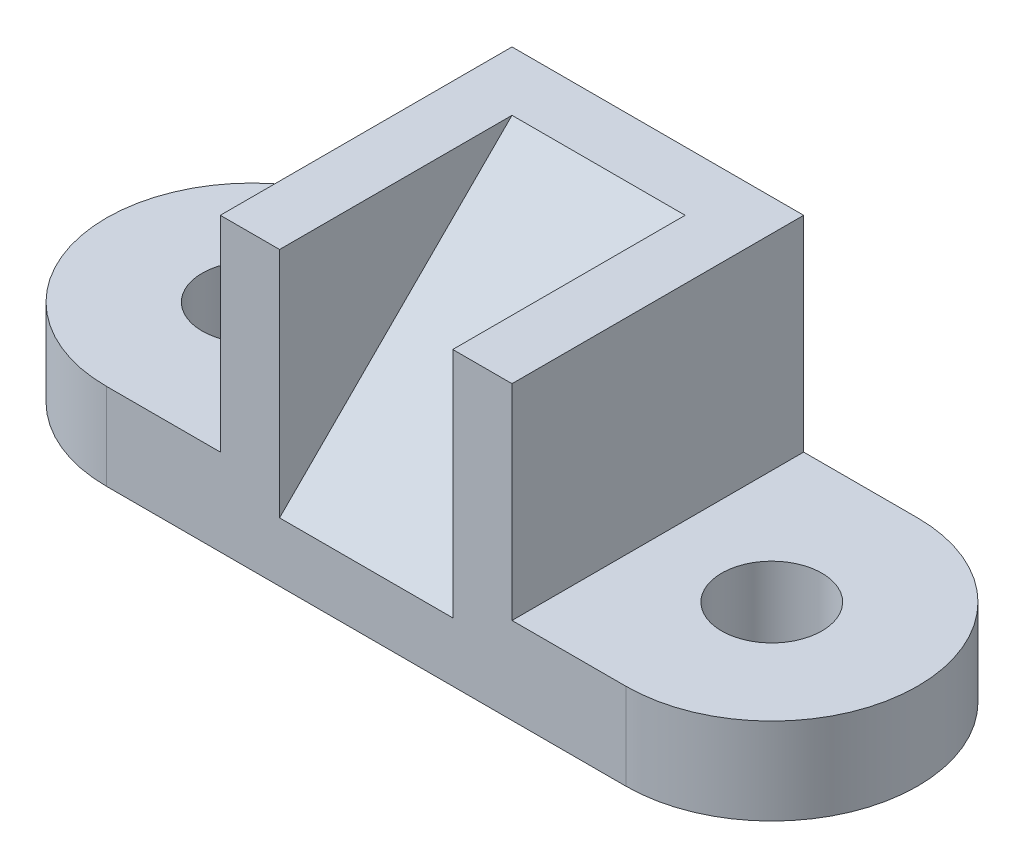
ISO-10303-21;
HEADER;
FILE_DESCRIPTION(('STEP AP214'),'2;1');
FILE_NAME('part.step','',(''),(''),'','','');
FILE_SCHEMA(('AUTOMOTIVE_DESIGN { 1 0 10303 214 1 1 1 1 }'));
ENDSEC;
DATA;
#1=APPLICATION_CONTEXT('core data for automotive mechanical design processes');
#2=APPLICATION_PROTOCOL_DEFINITION('international standard','automotive_design',2000,#1);
#3=PRODUCT_CONTEXT('',#1,'mechanical');
#4=PRODUCT('Part','Part','',(#3));
#5=PRODUCT_RELATED_PRODUCT_CATEGORY('part','',(#4));
#6=PRODUCT_DEFINITION_FORMATION('','',#4);
#7=PRODUCT_DEFINITION_CONTEXT('part definition',#1,'design');
#8=PRODUCT_DEFINITION('design','',#6,#7);
#9=PRODUCT_DEFINITION_SHAPE('','',#8);
#10=(LENGTH_UNIT() NAMED_UNIT(*) SI_UNIT(.MILLI.,.METRE.));
#11=(NAMED_UNIT(*) PLANE_ANGLE_UNIT() SI_UNIT($,.RADIAN.));
#12=(NAMED_UNIT(*) SI_UNIT($,.STERADIAN.) SOLID_ANGLE_UNIT());
#13=UNCERTAINTY_MEASURE_WITH_UNIT(LENGTH_MEASURE(1.E-05),#10,'distance_accuracy_value','');
#14=(GEOMETRIC_REPRESENTATION_CONTEXT(3) GLOBAL_UNCERTAINTY_ASSIGNED_CONTEXT((#13)) GLOBAL_UNIT_ASSIGNED_CONTEXT((#10,
#11,#12)) REPRESENTATION_CONTEXT('',''));
#15=CARTESIAN_POINT('',(0.,0.,0.));
#16=DIRECTION('',(0.,0.,1.));
#17=DIRECTION('',(1.,0.,0.));
#18=AXIS2_PLACEMENT_3D('',#15,#16,#17);
#19=CARTESIAN_POINT('',(0.,19.,32.));
#20=DIRECTION('',(0.,0.,-1.));
#21=DIRECTION('',(-1.,0.,0.));
#22=AXIS2_PLACEMENT_3D('',#19,#20,#21);
#23=PLANE('',#22);
#24=DIRECTION('',(0.,-1.,0.));
#25=VECTOR('',#24,1.);
#26=CARTESIAN_POINT('',(-19.,64.,32.));
#27=LINE('',#26,#25);
#28=CARTESIAN_POINT('',(-19.,64.,32.));
#29=VERTEX_POINT('',#28);
#30=CARTESIAN_POINT('',(-19.,13.,32.));
#31=VERTEX_POINT('',#30);
#32=EDGE_CURVE('E151',#29,#31,#27,.T.);
#33=ORIENTED_EDGE('',*,*,#32,.F.);
#34=DIRECTION('',(1.,0.,0.));
#35=VECTOR('',#34,1.);
#36=CARTESIAN_POINT('',(0.,64.,32.));
#37=LINE('',#36,#35);
#38=CARTESIAN_POINT('',(-32.,64.,32.));
#39=VERTEX_POINT('',#38);
#40=EDGE_CURVE('E193',#39,#29,#37,.T.);
#41=ORIENTED_EDGE('',*,*,#40,.F.);
#42=DIRECTION('',(0.,-1.,0.));
#43=VECTOR('',#42,1.);
#44=CARTESIAN_POINT('',(-32.,64.,32.));
#45=LINE('',#44,#43);
#46=CARTESIAN_POINT('',(-32.,19.,32.));
#47=VERTEX_POINT('',#46);
#48=EDGE_CURVE('E208',#39,#47,#45,.T.);
#49=ORIENTED_EDGE('',*,*,#48,.T.);
#50=DIRECTION('',(1.,0.,0.));
#51=VECTOR('',#50,1.);
#52=CARTESIAN_POINT('',(0.,19.,32.));
#53=LINE('',#52,#51);
#54=CARTESIAN_POINT('',(-57.,19.,32.));
#55=VERTEX_POINT('',#54);
#56=EDGE_CURVE('E237',#55,#47,#53,.T.);
#57=ORIENTED_EDGE('',*,*,#56,.F.);
#58=DIRECTION('',(0.,-1.,0.));
#59=VECTOR('',#58,1.);
#60=CARTESIAN_POINT('',(-57.,19.,32.));
#61=LINE('',#60,#59);
#62=CARTESIAN_POINT('',(-57.,0.,32.));
#63=VERTEX_POINT('',#62);
#64=EDGE_CURVE('E50',#55,#63,#61,.T.);
#65=ORIENTED_EDGE('',*,*,#64,.T.);
#66=DIRECTION('',(1.,0.,0.));
#67=VECTOR('',#66,1.);
#68=CARTESIAN_POINT('',(0.,0.,32.));
#69=LINE('',#68,#67);
#70=CARTESIAN_POINT('',(57.,0.,32.));
#71=VERTEX_POINT('',#70);
#72=EDGE_CURVE('E229',#63,#71,#69,.T.);
#73=ORIENTED_EDGE('',*,*,#72,.T.);
#74=DIRECTION('',(0.,-1.,0.));
#75=VECTOR('',#74,1.);
#76=CARTESIAN_POINT('',(57.,19.,32.));
#77=LINE('',#76,#75);
#78=CARTESIAN_POINT('',(57.,19.,32.));
#79=VERTEX_POINT('',#78);
#80=EDGE_CURVE('E189',#79,#71,#77,.T.);
#81=ORIENTED_EDGE('',*,*,#80,.F.);
#82=DIRECTION('',(1.,0.,0.));
#83=VECTOR('',#82,1.);
#84=CARTESIAN_POINT('',(0.,19.,32.));
#85=LINE('',#84,#83);
#86=CARTESIAN_POINT('',(32.,19.,32.));
#87=VERTEX_POINT('',#86);
#88=EDGE_CURVE('E166',#87,#79,#85,.T.);
#89=ORIENTED_EDGE('',*,*,#88,.F.);
#90=DIRECTION('',(0.,-1.,0.));
#91=VECTOR('',#90,1.);
#92=CARTESIAN_POINT('',(32.,64.,32.));
#93=LINE('',#92,#91);
#94=CARTESIAN_POINT('',(32.,64.,32.));
#95=VERTEX_POINT('',#94);
#96=EDGE_CURVE('E219',#95,#87,#93,.T.);
#97=ORIENTED_EDGE('',*,*,#96,.F.);
#98=CARTESIAN_POINT('',(19.,64.,32.));
#99=VERTEX_POINT('',#98);
#100=EDGE_CURVE('E145',#99,#95,#37,.T.);
#101=ORIENTED_EDGE('',*,*,#100,.F.);
#102=DIRECTION('',(0.,-1.,0.));
#103=VECTOR('',#102,1.);
#104=CARTESIAN_POINT('',(19.,64.,32.));
#105=LINE('',#104,#103);
#106=CARTESIAN_POINT('',(19.,13.,32.));
#107=VERTEX_POINT('',#106);
#108=EDGE_CURVE('E57',#99,#107,#105,.T.);
#109=ORIENTED_EDGE('',*,*,#108,.T.);
#110=DIRECTION('',(1.,0.,0.));
#111=VECTOR('',#110,1.);
#112=CARTESIAN_POINT('',(-19.,13.,32.));
#113=LINE('',#112,#111);
#114=EDGE_CURVE('E127',#31,#107,#113,.T.);
#115=ORIENTED_EDGE('',*,*,#114,.F.);
#116=EDGE_LOOP('',(#33,#41,#49,#57,#65,#73,#81,#89,#97,#101,#109,#115));
#117=FACE_BOUND('',#116,.T.);
#118=ADVANCED_FACE('F41',(#117),#23,.F.);
#119=CARTESIAN_POINT('',(0.,64.,0.));
#120=DIRECTION('',(0.,1.,0.));
#121=DIRECTION('',(0.,0.,1.));
#122=AXIS2_PLACEMENT_3D('',#119,#120,#121);
#123=PLANE('',#122);
#124=ORIENTED_EDGE('',*,*,#40,.T.);
#125=DIRECTION('',(0.,0.,-1.));
#126=VECTOR('',#125,1.);
#127=CARTESIAN_POINT('',(-19.,64.,32.));
#128=LINE('',#127,#126);
#129=CARTESIAN_POINT('',(-19.,64.,-19.));
#130=VERTEX_POINT('',#129);
#131=EDGE_CURVE('E136',#29,#130,#128,.T.);
#132=ORIENTED_EDGE('',*,*,#131,.T.);
#133=DIRECTION('',(1.,0.,0.));
#134=VECTOR('',#133,1.);
#135=CARTESIAN_POINT('',(-19.,64.,-19.));
#136=LINE('',#135,#134);
#137=CARTESIAN_POINT('',(19.,64.,-19.));
#138=VERTEX_POINT('',#137);
#139=EDGE_CURVE('E135',#130,#138,#136,.T.);
#140=ORIENTED_EDGE('',*,*,#139,.T.);
#141=DIRECTION('',(0.,0.,-1.));
#142=VECTOR('',#141,1.);
#143=CARTESIAN_POINT('',(19.,64.,32.));
#144=LINE('',#143,#142);
#145=EDGE_CURVE('E139',#99,#138,#144,.T.);
#146=ORIENTED_EDGE('',*,*,#145,.F.);
#147=ORIENTED_EDGE('',*,*,#100,.T.);
#148=DIRECTION('',(0.,0.,-1.));
#149=VECTOR('',#148,1.);
#150=CARTESIAN_POINT('',(32.,64.,0.));
#151=LINE('',#150,#149);
#152=CARTESIAN_POINT('',(32.,64.,-32.));
#153=VERTEX_POINT('',#152);
#154=EDGE_CURVE('E197',#95,#153,#151,.T.);
#155=ORIENTED_EDGE('',*,*,#154,.T.);
#156=DIRECTION('',(1.,0.,0.));
#157=VECTOR('',#156,1.);
#158=CARTESIAN_POINT('',(0.,64.,-32.));
#159=LINE('',#158,#157);
#160=CARTESIAN_POINT('',(-32.,64.,-32.));
#161=VERTEX_POINT('',#160);
#162=EDGE_CURVE('E200',#161,#153,#159,.T.);
#163=ORIENTED_EDGE('',*,*,#162,.F.);
#164=DIRECTION('',(0.,0.,-1.));
#165=VECTOR('',#164,1.);
#166=CARTESIAN_POINT('',(-32.,64.,0.));
#167=LINE('',#166,#165);
#168=EDGE_CURVE('E204',#39,#161,#167,.T.);
#169=ORIENTED_EDGE('',*,*,#168,.F.);
#170=EDGE_LOOP('',(#124,#132,#140,#146,#147,#155,#163,#169));
#171=FACE_BOUND('',#170,.T.);
#172=ADVANCED_FACE('F281',(#171),#123,.T.);
#173=CARTESIAN_POINT('',(0.,19.,-32.));
#174=DIRECTION('',(0.,0.,-1.));
#175=DIRECTION('',(-1.,0.,0.));
#176=AXIS2_PLACEMENT_3D('',#173,#174,#175);
#177=PLANE('',#176);
#178=DIRECTION('',(1.,0.,0.));
#179=VECTOR('',#178,1.);
#180=CARTESIAN_POINT('',(0.,0.,-32.));
#181=LINE('',#180,#179);
#182=CARTESIAN_POINT('',(-57.,0.,-32.));
#183=VERTEX_POINT('',#182);
#184=CARTESIAN_POINT('',(57.,0.,-32.));
#185=VERTEX_POINT('',#184);
#186=EDGE_CURVE('E248',#183,#185,#181,.T.);
#187=ORIENTED_EDGE('',*,*,#186,.F.);
#188=DIRECTION('',(0.,-1.,0.));
#189=VECTOR('',#188,1.);
#190=CARTESIAN_POINT('',(-57.,19.,-32.));
#191=LINE('',#190,#189);
#192=CARTESIAN_POINT('',(-57.,19.,-32.));
#193=VERTEX_POINT('',#192);
#194=EDGE_CURVE('E11',#193,#183,#191,.T.);
#195=ORIENTED_EDGE('',*,*,#194,.F.);
#196=DIRECTION('',(1.,0.,0.));
#197=VECTOR('',#196,1.);
#198=CARTESIAN_POINT('',(0.,19.,-32.));
#199=LINE('',#198,#197);
#200=CARTESIAN_POINT('',(-32.,19.,-32.));
#201=VERTEX_POINT('',#200);
#202=EDGE_CURVE('E228',#193,#201,#199,.T.);
#203=ORIENTED_EDGE('',*,*,#202,.T.);
#204=DIRECTION('',(0.,-1.,0.));
#205=VECTOR('',#204,1.);
#206=CARTESIAN_POINT('',(-32.,64.,-32.));
#207=LINE('',#206,#205);
#208=EDGE_CURVE('E212',#161,#201,#207,.T.);
#209=ORIENTED_EDGE('',*,*,#208,.F.);
#210=ORIENTED_EDGE('',*,*,#162,.T.);
#211=DIRECTION('',(0.,-1.,0.));
#212=VECTOR('',#211,1.);
#213=CARTESIAN_POINT('',(32.,64.,-32.));
#214=LINE('',#213,#212);
#215=CARTESIAN_POINT('',(32.,19.,-32.));
#216=VERTEX_POINT('',#215);
#217=EDGE_CURVE('E215',#153,#216,#214,.T.);
#218=ORIENTED_EDGE('',*,*,#217,.T.);
#219=DIRECTION('',(1.,0.,0.));
#220=VECTOR('',#219,1.);
#221=CARTESIAN_POINT('',(0.,19.,-32.));
#222=LINE('',#221,#220);
#223=CARTESIAN_POINT('',(57.,19.,-32.));
#224=VERTEX_POINT('',#223);
#225=EDGE_CURVE('E65',#216,#224,#222,.T.);
#226=ORIENTED_EDGE('',*,*,#225,.T.);
#227=DIRECTION('',(0.,-1.,0.));
#228=VECTOR('',#227,1.);
#229=CARTESIAN_POINT('',(57.,19.,-32.));
#230=LINE('',#229,#228);
#231=EDGE_CURVE('E179',#224,#185,#230,.T.);
#232=ORIENTED_EDGE('',*,*,#231,.T.);
#233=EDGE_LOOP('',(#187,#195,#203,#209,#210,#218,#226,#232));
#234=FACE_BOUND('',#233,.T.);
#235=ADVANCED_FACE('F270',(#234),#177,.T.);
#236=CARTESIAN_POINT('',(-57.,19.,0.));
#237=DIRECTION('',(0.,-1.,0.));
#238=DIRECTION('',(0.,0.,-1.));
#239=AXIS2_PLACEMENT_3D('',#236,#237,#238);
#240=CYLINDRICAL_SURFACE('',#239,32.);
#241=CARTESIAN_POINT('',(-57.,0.,0.));
#242=DIRECTION('',(0.,1.,0.));
#243=DIRECTION('',(0.,0.,1.));
#244=AXIS2_PLACEMENT_3D('',#241,#242,#243);
#245=CIRCLE('',#244,32.);
#246=EDGE_CURVE('E251',#183,#63,#245,.T.);
#247=ORIENTED_EDGE('',*,*,#246,.T.);
#248=ORIENTED_EDGE('',*,*,#64,.F.);
#249=CARTESIAN_POINT('',(-57.,19.,0.));
#250=DIRECTION('',(0.,1.,0.));
#251=DIRECTION('',(0.,0.,1.));
#252=AXIS2_PLACEMENT_3D('',#249,#250,#251);
#253=CIRCLE('',#252,32.);
#254=EDGE_CURVE('E233',#193,#55,#253,.T.);
#255=ORIENTED_EDGE('',*,*,#254,.F.);
#256=ORIENTED_EDGE('',*,*,#194,.T.);
#257=EDGE_LOOP('',(#247,#248,#255,#256));
#258=FACE_BOUND('',#257,.T.);
#259=ADVANCED_FACE('F264',(#258),#240,.T.);
#260=CARTESIAN_POINT('',(-57.,19.,0.));
#261=DIRECTION('',(0.,-1.,0.));
#262=DIRECTION('',(0.,0.,-1.));
#263=AXIS2_PLACEMENT_3D('',#260,#261,#262);
#264=CYLINDRICAL_SURFACE('',#263,11.);
#265=CARTESIAN_POINT('',(-57.,19.,0.));
#266=DIRECTION('',(0.,1.,0.));
#267=DIRECTION('',(0.,0.,1.));
#268=AXIS2_PLACEMENT_3D('',#265,#266,#267);
#269=CIRCLE('',#268,11.);
#270=CARTESIAN_POINT('',(-57.,19.,11.));
#271=VERTEX_POINT('',#270);
#272=EDGE_CURVE('E224',#271,#271,#269,.T.);
#273=ORIENTED_EDGE('',*,*,#272,.T.);
#274=EDGE_LOOP('',(#273));
#275=FACE_BOUND('',#274,.T.);
#276=CARTESIAN_POINT('',(-57.,0.,0.));
#277=DIRECTION('',(0.,1.,0.));
#278=DIRECTION('',(0.,0.,1.));
#279=AXIS2_PLACEMENT_3D('',#276,#277,#278);
#280=CIRCLE('',#279,11.);
#281=CARTESIAN_POINT('',(-57.,0.,11.));
#282=VERTEX_POINT('',#281);
#283=EDGE_CURVE('E223',#282,#282,#280,.T.);
#284=ORIENTED_EDGE('',*,*,#283,.F.);
#285=EDGE_LOOP('',(#284));
#286=FACE_BOUND('',#285,.T.);
#287=ADVANCED_FACE('F43',(#275,#286),#264,.F.);
#288=CARTESIAN_POINT('',(0.,19.,0.));
#289=DIRECTION('',(0.,1.,0.));
#290=DIRECTION('',(0.,0.,1.));
#291=AXIS2_PLACEMENT_3D('',#288,#289,#290);
#292=PLANE('',#291);
#293=ORIENTED_EDGE('',*,*,#272,.F.);
#294=EDGE_LOOP('',(#293));
#295=FACE_BOUND('',#294,.T.);
#296=ORIENTED_EDGE('',*,*,#202,.F.);
#297=ORIENTED_EDGE('',*,*,#254,.T.);
#298=ORIENTED_EDGE('',*,*,#56,.T.);
#299=DIRECTION('',(0.,0.,-1.));
#300=VECTOR('',#299,1.);
#301=CARTESIAN_POINT('',(-32.,19.,0.));
#302=LINE('',#301,#300);
#303=EDGE_CURVE('E241',#47,#201,#302,.T.);
#304=ORIENTED_EDGE('',*,*,#303,.T.);
#305=EDGE_LOOP('',(#296,#297,#298,#304));
#306=FACE_BOUND('',#305,.T.);
#307=ADVANCED_FACE('F291',(#295,#306),#292,.T.);
#308=CARTESIAN_POINT('',(0.,0.,0.));
#309=DIRECTION('',(0.,1.,0.));
#310=DIRECTION('',(0.,0.,1.));
#311=AXIS2_PLACEMENT_3D('',#308,#309,#310);
#312=PLANE('',#311);
#313=ORIENTED_EDGE('',*,*,#283,.T.);
#314=EDGE_LOOP('',(#313));
#315=FACE_BOUND('',#314,.T.);
#316=ORIENTED_EDGE('',*,*,#186,.T.);
#317=CARTESIAN_POINT('',(57.,0.,0.));
#318=DIRECTION('',(0.,1.,0.));
#319=DIRECTION('',(0.,0.,1.));
#320=AXIS2_PLACEMENT_3D('',#317,#318,#319);
#321=CIRCLE('',#320,32.);
#322=EDGE_CURVE('E167',#71,#185,#321,.T.);
#323=ORIENTED_EDGE('',*,*,#322,.F.);
#324=ORIENTED_EDGE('',*,*,#72,.F.);
#325=ORIENTED_EDGE('',*,*,#246,.F.);
#326=EDGE_LOOP('',(#316,#323,#324,#325));
#327=FACE_BOUND('',#326,.T.);
#328=CARTESIAN_POINT('',(57.,0.,0.));
#329=DIRECTION('',(0.,1.,0.));
#330=DIRECTION('',(0.,0.,1.));
#331=AXIS2_PLACEMENT_3D('',#328,#329,#330);
#332=CIRCLE('',#331,11.);
#333=CARTESIAN_POINT('',(57.,0.,11.));
#334=VERTEX_POINT('',#333);
#335=EDGE_CURVE('E160',#334,#334,#332,.T.);
#336=ORIENTED_EDGE('',*,*,#335,.T.);
#337=EDGE_LOOP('',(#336));
#338=FACE_BOUND('',#337,.T.);
#339=ADVANCED_FACE('F267',(#315,#327,#338),#312,.F.);
#340=CARTESIAN_POINT('',(-32.,64.,0.));
#341=DIRECTION('',(-1.,0.,0.));
#342=DIRECTION('',(0.,0.,1.));
#343=AXIS2_PLACEMENT_3D('',#340,#341,#342);
#344=PLANE('',#343);
#345=ORIENTED_EDGE('',*,*,#303,.F.);
#346=ORIENTED_EDGE('',*,*,#48,.F.);
#347=ORIENTED_EDGE('',*,*,#168,.T.);
#348=ORIENTED_EDGE('',*,*,#208,.T.);
#349=EDGE_LOOP('',(#345,#346,#347,#348));
#350=FACE_BOUND('',#349,.T.);
#351=ADVANCED_FACE('F288',(#350),#344,.T.);
#352=CARTESIAN_POINT('',(32.,64.,0.));
#353=DIRECTION('',(-1.,0.,0.));
#354=DIRECTION('',(0.,0.,1.));
#355=AXIS2_PLACEMENT_3D('',#352,#353,#354);
#356=PLANE('',#355);
#357=ORIENTED_EDGE('',*,*,#96,.T.);
#358=DIRECTION('',(0.,0.,-1.));
#359=VECTOR('',#358,1.);
#360=CARTESIAN_POINT('',(32.,19.,0.));
#361=LINE('',#360,#359);
#362=EDGE_CURVE('E176',#87,#216,#361,.T.);
#363=ORIENTED_EDGE('',*,*,#362,.T.);
#364=ORIENTED_EDGE('',*,*,#217,.F.);
#365=ORIENTED_EDGE('',*,*,#154,.F.);
#366=EDGE_LOOP('',(#357,#363,#364,#365));
#367=FACE_BOUND('',#366,.T.);
#368=ADVANCED_FACE('F278',(#367),#356,.F.);
#369=CARTESIAN_POINT('',(57.,19.,0.));
#370=DIRECTION('',(0.,-1.,0.));
#371=DIRECTION('',(0.,0.,-1.));
#372=AXIS2_PLACEMENT_3D('',#369,#370,#371);
#373=CYLINDRICAL_SURFACE('',#372,32.);
#374=ORIENTED_EDGE('',*,*,#322,.T.);
#375=ORIENTED_EDGE('',*,*,#231,.F.);
#376=CARTESIAN_POINT('',(57.,19.,0.));
#377=DIRECTION('',(0.,1.,0.));
#378=DIRECTION('',(0.,0.,1.));
#379=AXIS2_PLACEMENT_3D('',#376,#377,#378);
#380=CIRCLE('',#379,32.);
#381=EDGE_CURVE('E171',#79,#224,#380,.T.);
#382=ORIENTED_EDGE('',*,*,#381,.F.);
#383=ORIENTED_EDGE('',*,*,#80,.T.);
#384=EDGE_LOOP('',(#374,#375,#382,#383));
#385=FACE_BOUND('',#384,.T.);
#386=ADVANCED_FACE('F273',(#385),#373,.T.);
#387=CARTESIAN_POINT('',(57.,19.,0.));
#388=DIRECTION('',(0.,-1.,0.));
#389=DIRECTION('',(0.,0.,-1.));
#390=AXIS2_PLACEMENT_3D('',#387,#388,#389);
#391=CYLINDRICAL_SURFACE('',#390,11.);
#392=CARTESIAN_POINT('',(57.,19.,0.));
#393=DIRECTION('',(0.,1.,0.));
#394=DIRECTION('',(0.,0.,1.));
#395=AXIS2_PLACEMENT_3D('',#392,#393,#394);
#396=CIRCLE('',#395,11.);
#397=CARTESIAN_POINT('',(57.,19.,11.));
#398=VERTEX_POINT('',#397);
#399=EDGE_CURVE('E162',#398,#398,#396,.T.);
#400=ORIENTED_EDGE('',*,*,#399,.T.);
#401=EDGE_LOOP('',(#400));
#402=FACE_BOUND('',#401,.T.);
#403=ORIENTED_EDGE('',*,*,#335,.F.);
#404=EDGE_LOOP('',(#403));
#405=FACE_BOUND('',#404,.T.);
#406=ADVANCED_FACE('F352',(#402,#405),#391,.F.);
#407=CARTESIAN_POINT('',(0.,19.,0.));
#408=DIRECTION('',(0.,1.,0.));
#409=DIRECTION('',(0.,0.,1.));
#410=AXIS2_PLACEMENT_3D('',#407,#408,#409);
#411=PLANE('',#410);
#412=ORIENTED_EDGE('',*,*,#399,.F.);
#413=EDGE_LOOP('',(#412));
#414=FACE_BOUND('',#413,.T.);
#415=ORIENTED_EDGE('',*,*,#88,.T.);
#416=ORIENTED_EDGE('',*,*,#381,.T.);
#417=ORIENTED_EDGE('',*,*,#225,.F.);
#418=ORIENTED_EDGE('',*,*,#362,.F.);
#419=EDGE_LOOP('',(#415,#416,#417,#418));
#420=FACE_BOUND('',#419,.T.);
#421=ADVANCED_FACE('F274',(#414,#420),#411,.T.);
#422=CARTESIAN_POINT('',(-19.,64.,-19.));
#423=DIRECTION('',(0.,0.707106781186548,0.707106781186548));
#424=DIRECTION('',(0.,-0.707106781186548,0.707106781186548));
#425=AXIS2_PLACEMENT_3D('',#422,#423,#424);
#426=PLANE('',#425);
#427=ORIENTED_EDGE('',*,*,#139,.F.);
#428=DIRECTION('',(0.,-0.707106781186547,0.707106781186548));
#429=VECTOR('',#428,1.);
#430=CARTESIAN_POINT('',(-19.,64.,-19.));
#431=LINE('',#430,#429);
#432=EDGE_CURVE('E131',#130,#31,#431,.T.);
#433=ORIENTED_EDGE('',*,*,#432,.T.);
#434=ORIENTED_EDGE('',*,*,#114,.T.);
#435=DIRECTION('',(0.,-0.707106781186547,0.707106781186548));
#436=VECTOR('',#435,1.);
#437=CARTESIAN_POINT('',(19.,64.,-19.));
#438=LINE('',#437,#436);
#439=EDGE_CURVE('E129',#138,#107,#438,.T.);
#440=ORIENTED_EDGE('',*,*,#439,.F.);
#441=EDGE_LOOP('',(#427,#433,#434,#440));
#442=FACE_BOUND('',#441,.T.);
#443=ADVANCED_FACE('F128',(#442),#426,.T.);
#444=CARTESIAN_POINT('',(-19.,0.,0.));
#445=DIRECTION('',(1.,0.,0.));
#446=DIRECTION('',(0.,0.,-1.));
#447=AXIS2_PLACEMENT_3D('',#444,#445,#446);
#448=PLANE('',#447);
#449=ORIENTED_EDGE('',*,*,#32,.T.);
#450=ORIENTED_EDGE('',*,*,#432,.F.);
#451=ORIENTED_EDGE('',*,*,#131,.F.);
#452=EDGE_LOOP('',(#449,#450,#451));
#453=FACE_BOUND('',#452,.T.);
#454=ADVANCED_FACE('F285',(#453),#448,.T.);
#455=CARTESIAN_POINT('',(19.,0.,0.));
#456=DIRECTION('',(1.,0.,0.));
#457=DIRECTION('',(0.,0.,-1.));
#458=AXIS2_PLACEMENT_3D('',#455,#456,#457);
#459=PLANE('',#458);
#460=ORIENTED_EDGE('',*,*,#108,.F.);
#461=ORIENTED_EDGE('',*,*,#145,.T.);
#462=ORIENTED_EDGE('',*,*,#439,.T.);
#463=EDGE_LOOP('',(#460,#461,#462));
#464=FACE_BOUND('',#463,.T.);
#465=ADVANCED_FACE('F138',(#464),#459,.F.);
#466=CLOSED_SHELL('',(#118,#172,#235,#259,#287,#307,#339,#351,#368,#386,#406,#421,#443,#454,#465));
#467=MANIFOLD_SOLID_BREP('B2',#466);
#468=ADVANCED_BREP_SHAPE_REPRESENTATION('',(#18,#467),#14);
#469=SHAPE_DEFINITION_REPRESENTATION(#9,#468);
ENDSEC;
END-ISO-10303-21;
